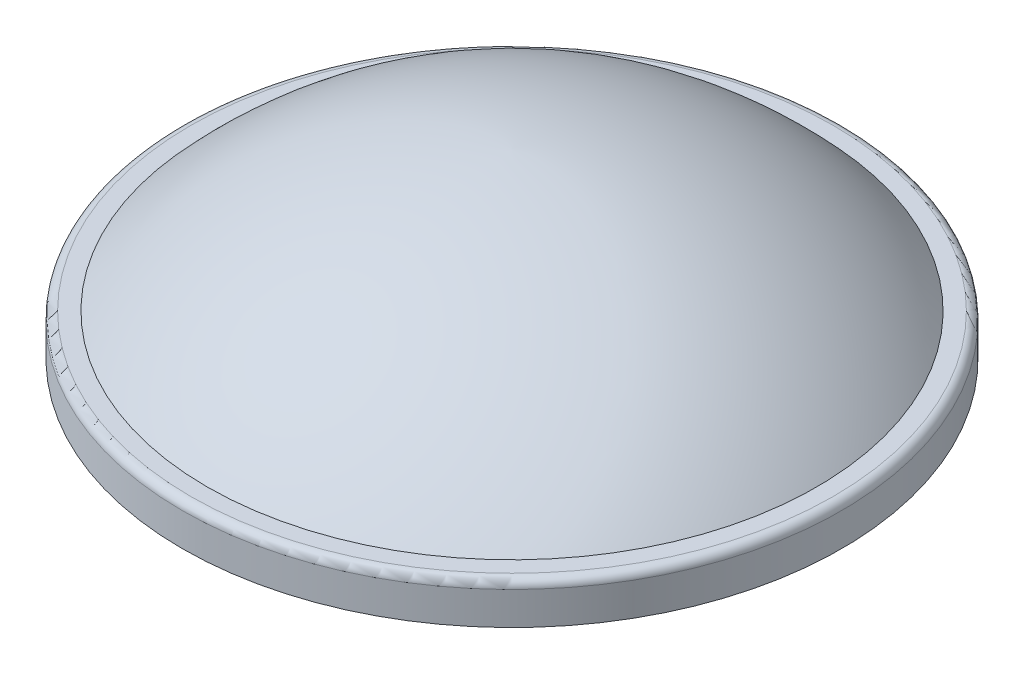
ISO-10303-21;
HEADER;
FILE_DESCRIPTION(('STEP AP214'),'2;1');
FILE_NAME('part.step','',(''),(''),'','','');
FILE_SCHEMA(('AUTOMOTIVE_DESIGN { 1 0 10303 214 1 1 1 1 }'));
ENDSEC;
DATA;
#1=APPLICATION_CONTEXT('core data for automotive mechanical design processes');
#2=APPLICATION_PROTOCOL_DEFINITION('international standard','automotive_design',2000,#1);
#3=PRODUCT_CONTEXT('',#1,'mechanical');
#4=PRODUCT('Part','Part','',(#3));
#5=PRODUCT_RELATED_PRODUCT_CATEGORY('part','',(#4));
#6=PRODUCT_DEFINITION_FORMATION('','',#4);
#7=PRODUCT_DEFINITION_CONTEXT('part definition',#1,'design');
#8=PRODUCT_DEFINITION('design','',#6,#7);
#9=PRODUCT_DEFINITION_SHAPE('','',#8);
#10=(LENGTH_UNIT() NAMED_UNIT(*) SI_UNIT(.MILLI.,.METRE.));
#11=(NAMED_UNIT(*) PLANE_ANGLE_UNIT() SI_UNIT($,.RADIAN.));
#12=(NAMED_UNIT(*) SI_UNIT($,.STERADIAN.) SOLID_ANGLE_UNIT());
#13=UNCERTAINTY_MEASURE_WITH_UNIT(LENGTH_MEASURE(1.E-05),#10,'distance_accuracy_value','');
#14=(GEOMETRIC_REPRESENTATION_CONTEXT(3) GLOBAL_UNCERTAINTY_ASSIGNED_CONTEXT((#13)) GLOBAL_UNIT_ASSIGNED_CONTEXT((#10,
#11,#12)) REPRESENTATION_CONTEXT('',''));
#15=CARTESIAN_POINT('',(0.,0.,0.));
#16=DIRECTION('',(0.,0.,1.));
#17=DIRECTION('',(1.,0.,0.));
#18=AXIS2_PLACEMENT_3D('',#15,#16,#17);
#19=CARTESIAN_POINT('',(0.,0.,0.));
#20=DIRECTION('',(0.,1.,0.));
#21=DIRECTION('',(0.,0.,1.));
#22=AXIS2_PLACEMENT_3D('',#19,#20,#21);
#23=PLANE('',#22);
#24=CARTESIAN_POINT('',(0.,0.,0.));
#25=DIRECTION('',(0.,-1.,0.));
#26=DIRECTION('',(0.,0.,-1.));
#27=AXIS2_PLACEMENT_3D('',#24,#25,#26);
#28=CIRCLE('',#27,4.);
#29=CARTESIAN_POINT('',(0.,0.,-4.));
#30=VERTEX_POINT('',#29);
#31=EDGE_CURVE('E67',#30,#30,#28,.T.);
#32=ORIENTED_EDGE('',*,*,#31,.T.);
#33=EDGE_LOOP('',(#32));
#34=FACE_BOUND('',#33,.T.);
#35=ADVANCED_FACE('F34',(#34),#23,.F.);
#36=CARTESIAN_POINT('',(0.,-1.369247278453,0.));
#37=DIRECTION('',(0.,-1.,0.));
#38=DIRECTION('',(0.,0.,-1.));
#39=AXIS2_PLACEMENT_3D('',#36,#37,#38);
#40=CYLINDRICAL_SURFACE('',#39,4.);
#41=CARTESIAN_POINT('',(0.,0.4,0.));
#42=DIRECTION('',(0.,-1.,0.));
#43=DIRECTION('',(0.,0.,-1.));
#44=AXIS2_PLACEMENT_3D('',#41,#42,#43);
#45=CIRCLE('',#44,4.);
#46=CARTESIAN_POINT('',(0.,0.4,-4.));
#47=VERTEX_POINT('',#46);
#48=EDGE_CURVE('E40',#47,#47,#45,.T.);
#49=ORIENTED_EDGE('',*,*,#48,.T.);
#50=EDGE_LOOP('',(#49));
#51=FACE_BOUND('',#50,.T.);
#52=ORIENTED_EDGE('',*,*,#31,.F.);
#53=EDGE_LOOP('',(#52));
#54=FACE_BOUND('',#53,.T.);
#55=ADVANCED_FACE('F55',(#51,#54),#40,.T.);
#56=CARTESIAN_POINT('',(-4.,0.499999999999999,0.));
#57=DIRECTION('',(0.,-1.,0.));
#58=DIRECTION('',(0.,0.,-1.));
#59=AXIS2_PLACEMENT_3D('',#56,#57,#58);
#60=PLANE('',#59);
#61=CARTESIAN_POINT('',(0.,0.499999999999999,0.));
#62=DIRECTION('',(0.,-1.,0.));
#63=DIRECTION('',(0.,0.,-1.));
#64=AXIS2_PLACEMENT_3D('',#61,#62,#63);
#65=CIRCLE('',#64,3.9);
#66=CARTESIAN_POINT('',(0.,0.499999999999999,-3.9));
#67=VERTEX_POINT('',#66);
#68=EDGE_CURVE('E11',#67,#67,#65,.F.);
#69=ORIENTED_EDGE('',*,*,#68,.T.);
#70=EDGE_LOOP('',(#69));
#71=FACE_BOUND('',#70,.T.);
#72=CARTESIAN_POINT('',(0.,0.5,0.));
#73=DIRECTION('',(0.,-1.,0.));
#74=DIRECTION('',(0.,0.,-1.));
#75=AXIS2_PLACEMENT_3D('',#72,#73,#74);
#76=CIRCLE('',#75,3.7);
#77=CARTESIAN_POINT('',(0.,0.5,-3.7));
#78=VERTEX_POINT('',#77);
#79=EDGE_CURVE('E69',#78,#78,#76,.T.);
#80=ORIENTED_EDGE('',*,*,#79,.T.);
#81=EDGE_LOOP('',(#80));
#82=FACE_BOUND('',#81,.T.);
#83=ADVANCED_FACE('F46',(#71,#82),#60,.F.);
#84=CARTESIAN_POINT('',(0.,-3.04652472459475,0.167508730682573));
#85=DIRECTION('',(-1.,0.,0.));
#86=DIRECTION('',(0.,0.,-1.));
#87=AXIS2_PLACEMENT_3D('',#84,#85,#86);
#88=CIRCLE('',#87,5.24742426377626);
#89=TRIMMED_CURVE('',#88,(PARAMETER_VALUE(-1.5388688163769)),(PARAMETER_VALUE(1.5388688163769)),
.T.,.PARAMETER.);
#90=CARTESIAN_POINT('',(0.,-3.04652472459475,0.));
#91=DIRECTION('',(0.,-1.,0.));
#92=AXIS1_PLACEMENT('',#90,#91);
#93=SURFACE_OF_REVOLUTION('',#89,#92);
#94=ORIENTED_EDGE('',*,*,#79,.F.);
#95=EDGE_LOOP('',(#94));
#96=FACE_BOUND('',#95,.T.);
#97=CARTESIAN_POINT('',(0.,2.19822524363185,0.));
#98=VERTEX_POINT('',#97);
#99=VERTEX_LOOP('',#98);
#100=FACE_BOUND('',#99,.T.);
#101=ADVANCED_FACE('F43',(#96,#100),#93,.T.);
#102=CARTESIAN_POINT('',(0.,0.4,0.));
#103=DIRECTION('',(0.,-1.,0.));
#104=DIRECTION('',(0.,0.,-1.));
#105=AXIS2_PLACEMENT_3D('',#102,#103,#104);
#106=TOROIDAL_SURFACE('',#105,3.9,0.1);
#107=ORIENTED_EDGE('',*,*,#68,.F.);
#108=EDGE_LOOP('',(#107));
#109=FACE_BOUND('',#108,.T.);
#110=ORIENTED_EDGE('',*,*,#48,.F.);
#111=EDGE_LOOP('',(#110));
#112=FACE_BOUND('',#111,.T.);
#113=ADVANCED_FACE('F45',(#109,#112),#106,.T.);
#114=CLOSED_SHELL('',(#35,#55,#83,#101,#113));
#115=MANIFOLD_SOLID_BREP('B2',#114);
#116=ADVANCED_BREP_SHAPE_REPRESENTATION('',(#18,#115),#14);
#117=SHAPE_DEFINITION_REPRESENTATION(#9,#116);
ENDSEC;
END-ISO-10303-21;
